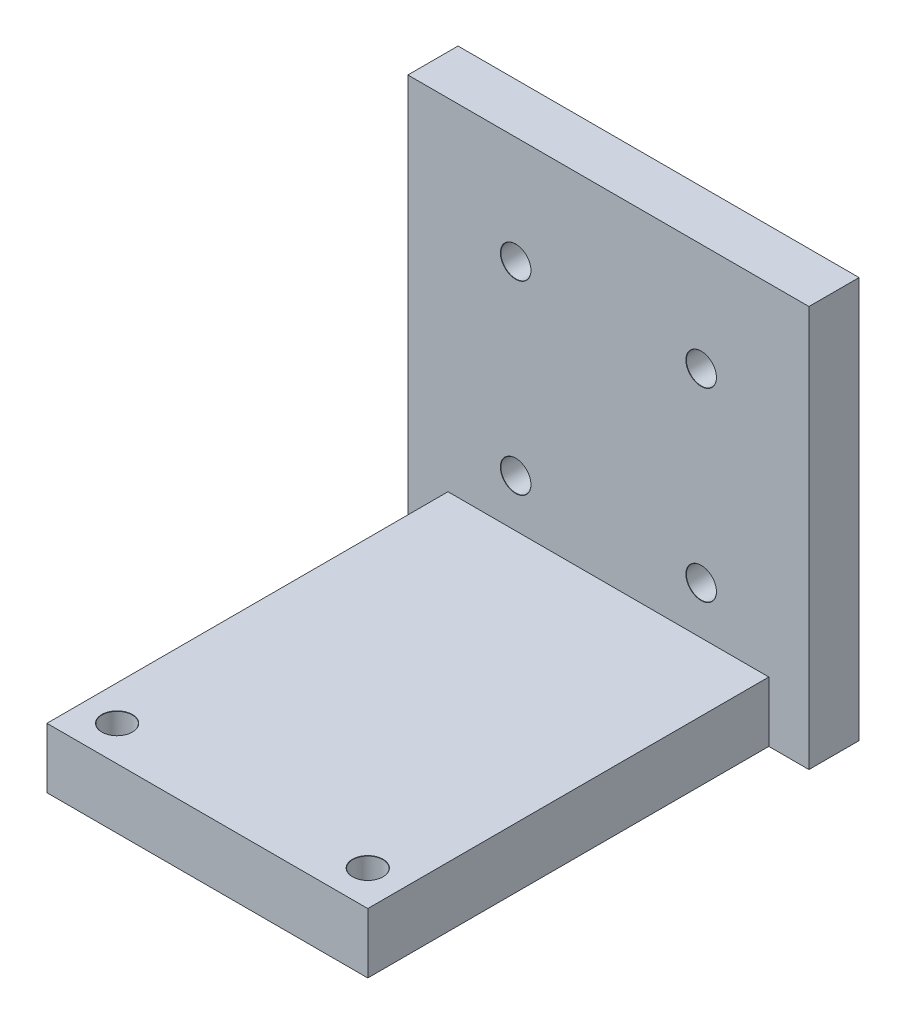
ISO-10303-21;
HEADER;
FILE_DESCRIPTION(('STEP AP214'),'2;1');
FILE_NAME('part.step','',(''),(''),'','','');
FILE_SCHEMA(('AUTOMOTIVE_DESIGN { 1 0 10303 214 1 1 1 1 }'));
ENDSEC;
DATA;
#1=APPLICATION_CONTEXT('core data for automotive mechanical design processes');
#2=APPLICATION_PROTOCOL_DEFINITION('international standard','automotive_design',2000,#1);
#3=PRODUCT_CONTEXT('',#1,'mechanical');
#4=PRODUCT('Part','Part','',(#3));
#5=PRODUCT_RELATED_PRODUCT_CATEGORY('part','',(#4));
#6=PRODUCT_DEFINITION_FORMATION('','',#4);
#7=PRODUCT_DEFINITION_CONTEXT('part definition',#1,'design');
#8=PRODUCT_DEFINITION('design','',#6,#7);
#9=PRODUCT_DEFINITION_SHAPE('','',#8);
#10=(LENGTH_UNIT() NAMED_UNIT(*) SI_UNIT(.MILLI.,.METRE.));
#11=(NAMED_UNIT(*) PLANE_ANGLE_UNIT() SI_UNIT($,.RADIAN.));
#12=(NAMED_UNIT(*) SI_UNIT($,.STERADIAN.) SOLID_ANGLE_UNIT());
#13=UNCERTAINTY_MEASURE_WITH_UNIT(LENGTH_MEASURE(1.E-05),#10,'distance_accuracy_value','');
#14=(GEOMETRIC_REPRESENTATION_CONTEXT(3) GLOBAL_UNCERTAINTY_ASSIGNED_CONTEXT((#13)) GLOBAL_UNIT_ASSIGNED_CONTEXT((#10,
#11,#12)) REPRESENTATION_CONTEXT('',''));
#15=CARTESIAN_POINT('',(0.,0.,0.));
#16=DIRECTION('',(0.,0.,1.));
#17=DIRECTION('',(1.,0.,0.));
#18=AXIS2_PLACEMENT_3D('',#15,#16,#17);
#19=CARTESIAN_POINT('',(0.,0.,5.));
#20=DIRECTION('',(0.,0.,-1.));
#21=DIRECTION('',(-1.,0.,0.));
#22=AXIS2_PLACEMENT_3D('',#19,#20,#21);
#23=PLANE('',#22);
#24=CARTESIAN_POINT('',(29.25,10.75,5.));
#25=DIRECTION('',(0.,0.,1.));
#26=DIRECTION('',(1.,0.,0.));
#27=AXIS2_PLACEMENT_3D('',#24,#25,#26);
#28=CIRCLE('',#27,1.525);
#29=CARTESIAN_POINT('',(30.775,10.75,5.));
#30=VERTEX_POINT('',#29);
#31=EDGE_CURVE('E171',#30,#30,#28,.T.);
#32=ORIENTED_EDGE('',*,*,#31,.F.);
#33=EDGE_LOOP('',(#32));
#34=FACE_BOUND('',#33,.T.);
#35=CARTESIAN_POINT('',(10.75,10.75,5.));
#36=DIRECTION('',(0.,0.,1.));
#37=DIRECTION('',(1.,0.,0.));
#38=AXIS2_PLACEMENT_3D('',#35,#36,#37);
#39=CIRCLE('',#38,1.525);
#40=CARTESIAN_POINT('',(12.275,10.75,5.));
#41=VERTEX_POINT('',#40);
#42=EDGE_CURVE('E159',#41,#41,#39,.T.);
#43=ORIENTED_EDGE('',*,*,#42,.F.);
#44=EDGE_LOOP('',(#43));
#45=FACE_BOUND('',#44,.T.);
#46=CARTESIAN_POINT('',(29.25,29.25,5.));
#47=DIRECTION('',(0.,0.,1.));
#48=DIRECTION('',(1.,0.,0.));
#49=AXIS2_PLACEMENT_3D('',#46,#47,#48);
#50=CIRCLE('',#49,1.525);
#51=CARTESIAN_POINT('',(30.775,29.25,5.));
#52=VERTEX_POINT('',#51);
#53=EDGE_CURVE('E147',#52,#52,#50,.T.);
#54=ORIENTED_EDGE('',*,*,#53,.F.);
#55=EDGE_LOOP('',(#54));
#56=FACE_BOUND('',#55,.T.);
#57=CARTESIAN_POINT('',(10.75,29.25,5.));
#58=DIRECTION('',(0.,0.,1.));
#59=DIRECTION('',(1.,0.,0.));
#60=AXIS2_PLACEMENT_3D('',#57,#58,#59);
#61=CIRCLE('',#60,1.525);
#62=CARTESIAN_POINT('',(12.275,29.25,5.));
#63=VERTEX_POINT('',#62);
#64=EDGE_CURVE('E129',#63,#63,#61,.T.);
#65=ORIENTED_EDGE('',*,*,#64,.F.);
#66=EDGE_LOOP('',(#65));
#67=FACE_BOUND('',#66,.T.);
#68=DIRECTION('',(0.,-1.,0.));
#69=VECTOR('',#68,1.);
#70=CARTESIAN_POINT('',(4.,0.,5.));
#71=LINE('',#70,#69);
#72=CARTESIAN_POINT('',(4.,6.,5.));
#73=VERTEX_POINT('',#72);
#74=CARTESIAN_POINT('',(4.,0.,5.));
#75=VERTEX_POINT('',#74);
#76=EDGE_CURVE('E55',#73,#75,#71,.T.);
#77=ORIENTED_EDGE('',*,*,#76,.F.);
#78=DIRECTION('',(-1.,0.,0.));
#79=VECTOR('',#78,1.);
#80=CARTESIAN_POINT('',(4.,6.,5.));
#81=LINE('',#80,#79);
#82=CARTESIAN_POINT('',(36.,6.,5.));
#83=VERTEX_POINT('',#82);
#84=EDGE_CURVE('E125',#83,#73,#81,.T.);
#85=ORIENTED_EDGE('',*,*,#84,.F.);
#86=DIRECTION('',(0.,1.,0.));
#87=VECTOR('',#86,1.);
#88=CARTESIAN_POINT('',(36.,0.,5.));
#89=LINE('',#88,#87);
#90=CARTESIAN_POINT('',(36.,0.,5.));
#91=VERTEX_POINT('',#90);
#92=EDGE_CURVE('E61',#91,#83,#89,.T.);
#93=ORIENTED_EDGE('',*,*,#92,.F.);
#94=DIRECTION('',(1.,0.,0.));
#95=VECTOR('',#94,1.);
#96=CARTESIAN_POINT('',(0.,0.,5.));
#97=LINE('',#96,#95);
#98=CARTESIAN_POINT('',(40.,0.,5.));
#99=VERTEX_POINT('',#98);
#100=EDGE_CURVE('E188',#91,#99,#97,.T.);
#101=ORIENTED_EDGE('',*,*,#100,.T.);
#102=DIRECTION('',(0.,1.,0.));
#103=VECTOR('',#102,1.);
#104=CARTESIAN_POINT('',(40.,0.,5.));
#105=LINE('',#104,#103);
#106=CARTESIAN_POINT('',(40.,40.,5.));
#107=VERTEX_POINT('',#106);
#108=EDGE_CURVE('E193',#99,#107,#105,.T.);
#109=ORIENTED_EDGE('',*,*,#108,.T.);
#110=DIRECTION('',(-1.,0.,0.));
#111=VECTOR('',#110,1.);
#112=CARTESIAN_POINT('',(0.,40.,5.));
#113=LINE('',#112,#111);
#114=CARTESIAN_POINT('',(0.,40.,5.));
#115=VERTEX_POINT('',#114);
#116=EDGE_CURVE('E196',#107,#115,#113,.T.);
#117=ORIENTED_EDGE('',*,*,#116,.T.);
#118=DIRECTION('',(0.,-1.,0.));
#119=VECTOR('',#118,1.);
#120=CARTESIAN_POINT('',(0.,0.,5.));
#121=LINE('',#120,#119);
#122=CARTESIAN_POINT('',(0.,0.,5.));
#123=VERTEX_POINT('',#122);
#124=EDGE_CURVE('E184',#115,#123,#121,.T.);
#125=ORIENTED_EDGE('',*,*,#124,.T.);
#126=EDGE_CURVE('E190',#123,#75,#97,.T.);
#127=ORIENTED_EDGE('',*,*,#126,.T.);
#128=EDGE_LOOP('',(#77,#85,#93,#101,#109,#117,#125,#127));
#129=FACE_BOUND('',#128,.T.);
#130=ADVANCED_FACE('F39',(#34,#45,#56,#67,#129),#23,.F.);
#131=CARTESIAN_POINT('',(0.,0.,5.));
#132=DIRECTION('',(1.,0.,0.));
#133=DIRECTION('',(0.,0.,-1.));
#134=AXIS2_PLACEMENT_3D('',#131,#132,#133);
#135=PLANE('',#134);
#136=DIRECTION('',(0.,-1.,0.));
#137=VECTOR('',#136,1.);
#138=CARTESIAN_POINT('',(0.,0.,0.));
#139=LINE('',#138,#137);
#140=CARTESIAN_POINT('',(0.,40.,0.));
#141=VERTEX_POINT('',#140);
#142=CARTESIAN_POINT('',(0.,0.,0.));
#143=VERTEX_POINT('',#142);
#144=EDGE_CURVE('E183',#141,#143,#139,.T.);
#145=ORIENTED_EDGE('',*,*,#144,.T.);
#146=DIRECTION('',(0.,0.,-1.));
#147=VECTOR('',#146,1.);
#148=CARTESIAN_POINT('',(0.,0.,5.));
#149=LINE('',#148,#147);
#150=EDGE_CURVE('E11',#123,#143,#149,.T.);
#151=ORIENTED_EDGE('',*,*,#150,.F.);
#152=ORIENTED_EDGE('',*,*,#124,.F.);
#153=DIRECTION('',(0.,0.,-1.));
#154=VECTOR('',#153,1.);
#155=CARTESIAN_POINT('',(0.,40.,5.));
#156=LINE('',#155,#154);
#157=EDGE_CURVE('E199',#115,#141,#156,.T.);
#158=ORIENTED_EDGE('',*,*,#157,.T.);
#159=EDGE_LOOP('',(#145,#151,#152,#158));
#160=FACE_BOUND('',#159,.T.);
#161=ADVANCED_FACE('F41',(#160),#135,.F.);
#162=CARTESIAN_POINT('',(0.,0.,5.));
#163=DIRECTION('',(0.,1.,0.));
#164=DIRECTION('',(0.,0.,1.));
#165=AXIS2_PLACEMENT_3D('',#162,#163,#164);
#166=PLANE('',#165);
#167=CARTESIAN_POINT('',(7.5,0.,41.5));
#168=DIRECTION('',(0.,1.,0.));
#169=DIRECTION('',(0.,0.,1.));
#170=AXIS2_PLACEMENT_3D('',#167,#168,#169);
#171=CIRCLE('',#170,1.5);
#172=CARTESIAN_POINT('',(7.5,0.,43.));
#173=VERTEX_POINT('',#172);
#174=EDGE_CURVE('E295',#173,#173,#171,.T.);
#175=ORIENTED_EDGE('',*,*,#174,.T.);
#176=EDGE_LOOP('',(#175));
#177=FACE_BOUND('',#176,.T.);
#178=CARTESIAN_POINT('',(32.5,0.,41.5));
#179=DIRECTION('',(0.,1.,0.));
#180=DIRECTION('',(0.,0.,1.));
#181=AXIS2_PLACEMENT_3D('',#178,#179,#180);
#182=CIRCLE('',#181,1.5);
#183=CARTESIAN_POINT('',(32.5,0.,43.));
#184=VERTEX_POINT('',#183);
#185=EDGE_CURVE('E249',#184,#184,#182,.T.);
#186=ORIENTED_EDGE('',*,*,#185,.T.);
#187=EDGE_LOOP('',(#186));
#188=FACE_BOUND('',#187,.T.);
#189=DIRECTION('',(1.,0.,0.));
#190=VECTOR('',#189,1.);
#191=CARTESIAN_POINT('',(0.,0.,0.));
#192=LINE('',#191,#190);
#193=CARTESIAN_POINT('',(40.,0.,0.));
#194=VERTEX_POINT('',#193);
#195=EDGE_CURVE('E203',#143,#194,#192,.T.);
#196=ORIENTED_EDGE('',*,*,#195,.T.);
#197=DIRECTION('',(0.,0.,-1.));
#198=VECTOR('',#197,1.);
#199=CARTESIAN_POINT('',(40.,0.,5.));
#200=LINE('',#199,#198);
#201=EDGE_CURVE('E48',#99,#194,#200,.T.);
#202=ORIENTED_EDGE('',*,*,#201,.F.);
#203=ORIENTED_EDGE('',*,*,#100,.F.);
#204=DIRECTION('',(0.,0.,-1.));
#205=VECTOR('',#204,1.);
#206=CARTESIAN_POINT('',(36.,0.,45.));
#207=LINE('',#206,#205);
#208=CARTESIAN_POINT('',(36.,0.,45.));
#209=VERTEX_POINT('',#208);
#210=EDGE_CURVE('E110',#209,#91,#207,.T.);
#211=ORIENTED_EDGE('',*,*,#210,.F.);
#212=DIRECTION('',(1.,0.,0.));
#213=VECTOR('',#212,1.);
#214=CARTESIAN_POINT('',(4.,0.,45.));
#215=LINE('',#214,#213);
#216=CARTESIAN_POINT('',(4.,0.,45.));
#217=VERTEX_POINT('',#216);
#218=EDGE_CURVE('E104',#217,#209,#215,.T.);
#219=ORIENTED_EDGE('',*,*,#218,.F.);
#220=DIRECTION('',(0.,0.,-1.));
#221=VECTOR('',#220,1.);
#222=CARTESIAN_POINT('',(4.,0.,45.));
#223=LINE('',#222,#221);
#224=EDGE_CURVE('E108',#217,#75,#223,.T.);
#225=ORIENTED_EDGE('',*,*,#224,.T.);
#226=ORIENTED_EDGE('',*,*,#126,.F.);
#227=ORIENTED_EDGE('',*,*,#150,.T.);
#228=EDGE_LOOP('',(#196,#202,#203,#211,#219,#225,#226,#227));
#229=FACE_BOUND('',#228,.T.);
#230=ADVANCED_FACE('F106',(#177,#188,#229),#166,.F.);
#231=CARTESIAN_POINT('',(40.,0.,5.));
#232=DIRECTION('',(-1.,0.,0.));
#233=DIRECTION('',(0.,0.,1.));
#234=AXIS2_PLACEMENT_3D('',#231,#232,#233);
#235=PLANE('',#234);
#236=DIRECTION('',(0.,1.,0.));
#237=VECTOR('',#236,1.);
#238=CARTESIAN_POINT('',(40.,0.,0.));
#239=LINE('',#238,#237);
#240=CARTESIAN_POINT('',(40.,40.,0.));
#241=VERTEX_POINT('',#240);
#242=EDGE_CURVE('E206',#194,#241,#239,.T.);
#243=ORIENTED_EDGE('',*,*,#242,.T.);
#244=DIRECTION('',(0.,0.,-1.));
#245=VECTOR('',#244,1.);
#246=CARTESIAN_POINT('',(40.,40.,5.));
#247=LINE('',#246,#245);
#248=EDGE_CURVE('E214',#107,#241,#247,.T.);
#249=ORIENTED_EDGE('',*,*,#248,.F.);
#250=ORIENTED_EDGE('',*,*,#108,.F.);
#251=ORIENTED_EDGE('',*,*,#201,.T.);
#252=EDGE_LOOP('',(#243,#249,#250,#251));
#253=FACE_BOUND('',#252,.T.);
#254=ADVANCED_FACE('F223',(#253),#235,.F.);
#255=CARTESIAN_POINT('',(0.,40.,5.));
#256=DIRECTION('',(0.,-1.,0.));
#257=DIRECTION('',(0.,0.,-1.));
#258=AXIS2_PLACEMENT_3D('',#255,#256,#257);
#259=PLANE('',#258);
#260=DIRECTION('',(-1.,0.,0.));
#261=VECTOR('',#260,1.);
#262=CARTESIAN_POINT('',(0.,40.,0.));
#263=LINE('',#262,#261);
#264=EDGE_CURVE('E189',#241,#141,#263,.T.);
#265=ORIENTED_EDGE('',*,*,#264,.T.);
#266=ORIENTED_EDGE('',*,*,#157,.F.);
#267=ORIENTED_EDGE('',*,*,#116,.F.);
#268=ORIENTED_EDGE('',*,*,#248,.T.);
#269=EDGE_LOOP('',(#265,#266,#267,#268));
#270=FACE_BOUND('',#269,.T.);
#271=ADVANCED_FACE('F231',(#270),#259,.F.);
#272=CARTESIAN_POINT('',(0.,0.,0.));
#273=DIRECTION('',(0.,0.,-1.));
#274=DIRECTION('',(-1.,0.,0.));
#275=AXIS2_PLACEMENT_3D('',#272,#273,#274);
#276=PLANE('',#275);
#277=CARTESIAN_POINT('',(10.75,29.25,0.));
#278=DIRECTION('',(0.,0.,1.));
#279=DIRECTION('',(1.,0.,0.));
#280=AXIS2_PLACEMENT_3D('',#277,#278,#279);
#281=CIRCLE('',#280,1.5);
#282=CARTESIAN_POINT('',(12.25,29.25,0.));
#283=VERTEX_POINT('',#282);
#284=EDGE_CURVE('E143',#283,#283,#281,.T.);
#285=ORIENTED_EDGE('',*,*,#284,.T.);
#286=EDGE_LOOP('',(#285));
#287=FACE_BOUND('',#286,.T.);
#288=CARTESIAN_POINT('',(29.25,29.25,0.));
#289=DIRECTION('',(0.,0.,1.));
#290=DIRECTION('',(1.,0.,0.));
#291=AXIS2_PLACEMENT_3D('',#288,#289,#290);
#292=CIRCLE('',#291,1.5);
#293=CARTESIAN_POINT('',(30.75,29.25,0.));
#294=VERTEX_POINT('',#293);
#295=EDGE_CURVE('E155',#294,#294,#292,.T.);
#296=ORIENTED_EDGE('',*,*,#295,.T.);
#297=EDGE_LOOP('',(#296));
#298=FACE_BOUND('',#297,.T.);
#299=CARTESIAN_POINT('',(10.75,10.75,0.));
#300=DIRECTION('',(0.,0.,1.));
#301=DIRECTION('',(1.,0.,0.));
#302=AXIS2_PLACEMENT_3D('',#299,#300,#301);
#303=CIRCLE('',#302,1.5);
#304=CARTESIAN_POINT('',(12.25,10.75,0.));
#305=VERTEX_POINT('',#304);
#306=EDGE_CURVE('E167',#305,#305,#303,.T.);
#307=ORIENTED_EDGE('',*,*,#306,.T.);
#308=EDGE_LOOP('',(#307));
#309=FACE_BOUND('',#308,.T.);
#310=CARTESIAN_POINT('',(29.25,10.75,0.));
#311=DIRECTION('',(0.,0.,1.));
#312=DIRECTION('',(1.,0.,0.));
#313=AXIS2_PLACEMENT_3D('',#310,#311,#312);
#314=CIRCLE('',#313,1.5);
#315=CARTESIAN_POINT('',(30.75,10.75,0.));
#316=VERTEX_POINT('',#315);
#317=EDGE_CURVE('E179',#316,#316,#314,.T.);
#318=ORIENTED_EDGE('',*,*,#317,.T.);
#319=EDGE_LOOP('',(#318));
#320=FACE_BOUND('',#319,.T.);
#321=ORIENTED_EDGE('',*,*,#144,.F.);
#322=ORIENTED_EDGE('',*,*,#264,.F.);
#323=ORIENTED_EDGE('',*,*,#242,.F.);
#324=ORIENTED_EDGE('',*,*,#195,.F.);
#325=EDGE_LOOP('',(#321,#322,#323,#324));
#326=FACE_BOUND('',#325,.T.);
#327=ADVANCED_FACE('F228',(#287,#298,#309,#320,#326),#276,.T.);
#328=CARTESIAN_POINT('',(29.25,10.75,5.));
#329=DIRECTION('',(0.,0.,1.));
#330=DIRECTION('',(1.,0.,0.));
#331=AXIS2_PLACEMENT_3D('',#328,#329,#330);
#332=CYLINDRICAL_SURFACE('',#331,1.5);
#333=ORIENTED_EDGE('',*,*,#317,.F.);
#334=EDGE_LOOP('',(#333));
#335=FACE_BOUND('',#334,.T.);
#336=CARTESIAN_POINT('',(29.25,10.75,4.975));
#337=DIRECTION('',(0.,0.,1.));
#338=DIRECTION('',(1.,0.,0.));
#339=AXIS2_PLACEMENT_3D('',#336,#337,#338);
#340=CIRCLE('',#339,1.5);
#341=CARTESIAN_POINT('',(30.75,10.75,4.975));
#342=VERTEX_POINT('',#341);
#343=EDGE_CURVE('E175',#342,#342,#340,.T.);
#344=ORIENTED_EDGE('',*,*,#343,.T.);
#345=EDGE_LOOP('',(#344));
#346=FACE_BOUND('',#345,.T.);
#347=ADVANCED_FACE('F280',(#335,#346),#332,.F.);
#348=CARTESIAN_POINT('',(29.25,10.75,5.));
#349=DIRECTION('',(0.,0.,1.));
#350=DIRECTION('',(1.,0.,0.));
#351=AXIS2_PLACEMENT_3D('',#348,#349,#350);
#352=CONICAL_SURFACE('',#351,1.525,0.785398163397466);
#353=ORIENTED_EDGE('',*,*,#343,.F.);
#354=EDGE_LOOP('',(#353));
#355=FACE_BOUND('',#354,.T.);
#356=ORIENTED_EDGE('',*,*,#31,.T.);
#357=EDGE_LOOP('',(#356));
#358=FACE_BOUND('',#357,.T.);
#359=ADVANCED_FACE('F450',(#355,#358),#352,.F.);
#360=CARTESIAN_POINT('',(10.75,10.75,5.));
#361=DIRECTION('',(0.,0.,1.));
#362=DIRECTION('',(1.,0.,0.));
#363=AXIS2_PLACEMENT_3D('',#360,#361,#362);
#364=CYLINDRICAL_SURFACE('',#363,1.5);
#365=ORIENTED_EDGE('',*,*,#306,.F.);
#366=EDGE_LOOP('',(#365));
#367=FACE_BOUND('',#366,.T.);
#368=CARTESIAN_POINT('',(10.75,10.75,4.975));
#369=DIRECTION('',(0.,0.,1.));
#370=DIRECTION('',(1.,0.,0.));
#371=AXIS2_PLACEMENT_3D('',#368,#369,#370);
#372=CIRCLE('',#371,1.5);
#373=CARTESIAN_POINT('',(12.25,10.75,4.975));
#374=VERTEX_POINT('',#373);
#375=EDGE_CURVE('E163',#374,#374,#372,.T.);
#376=ORIENTED_EDGE('',*,*,#375,.T.);
#377=EDGE_LOOP('',(#376));
#378=FACE_BOUND('',#377,.T.);
#379=ADVANCED_FACE('F441',(#367,#378),#364,.F.);
#380=CARTESIAN_POINT('',(10.75,10.75,5.));
#381=DIRECTION('',(0.,0.,1.));
#382=DIRECTION('',(1.,0.,0.));
#383=AXIS2_PLACEMENT_3D('',#380,#381,#382);
#384=CONICAL_SURFACE('',#383,1.525,0.785398163397466);
#385=ORIENTED_EDGE('',*,*,#375,.F.);
#386=EDGE_LOOP('',(#385));
#387=FACE_BOUND('',#386,.T.);
#388=ORIENTED_EDGE('',*,*,#42,.T.);
#389=EDGE_LOOP('',(#388));
#390=FACE_BOUND('',#389,.T.);
#391=ADVANCED_FACE('F432',(#387,#390),#384,.F.);
#392=CARTESIAN_POINT('',(29.25,29.25,5.));
#393=DIRECTION('',(0.,0.,1.));
#394=DIRECTION('',(1.,0.,0.));
#395=AXIS2_PLACEMENT_3D('',#392,#393,#394);
#396=CYLINDRICAL_SURFACE('',#395,1.5);
#397=ORIENTED_EDGE('',*,*,#295,.F.);
#398=EDGE_LOOP('',(#397));
#399=FACE_BOUND('',#398,.T.);
#400=CARTESIAN_POINT('',(29.25,29.25,4.975));
#401=DIRECTION('',(0.,0.,1.));
#402=DIRECTION('',(1.,0.,0.));
#403=AXIS2_PLACEMENT_3D('',#400,#401,#402);
#404=CIRCLE('',#403,1.5);
#405=CARTESIAN_POINT('',(30.75,29.25,4.975));
#406=VERTEX_POINT('',#405);
#407=EDGE_CURVE('E151',#406,#406,#404,.T.);
#408=ORIENTED_EDGE('',*,*,#407,.T.);
#409=EDGE_LOOP('',(#408));
#410=FACE_BOUND('',#409,.T.);
#411=ADVANCED_FACE('F423',(#399,#410),#396,.F.);
#412=CARTESIAN_POINT('',(29.25,29.25,5.));
#413=DIRECTION('',(0.,0.,1.));
#414=DIRECTION('',(1.,0.,0.));
#415=AXIS2_PLACEMENT_3D('',#412,#413,#414);
#416=CONICAL_SURFACE('',#415,1.525,0.785398163397466);
#417=ORIENTED_EDGE('',*,*,#407,.F.);
#418=EDGE_LOOP('',(#417));
#419=FACE_BOUND('',#418,.T.);
#420=ORIENTED_EDGE('',*,*,#53,.T.);
#421=EDGE_LOOP('',(#420));
#422=FACE_BOUND('',#421,.T.);
#423=ADVANCED_FACE('F414',(#419,#422),#416,.F.);
#424=CARTESIAN_POINT('',(10.75,29.25,5.));
#425=DIRECTION('',(0.,0.,1.));
#426=DIRECTION('',(1.,0.,0.));
#427=AXIS2_PLACEMENT_3D('',#424,#425,#426);
#428=CYLINDRICAL_SURFACE('',#427,1.5);
#429=ORIENTED_EDGE('',*,*,#284,.F.);
#430=EDGE_LOOP('',(#429));
#431=FACE_BOUND('',#430,.T.);
#432=CARTESIAN_POINT('',(10.75,29.25,4.975));
#433=DIRECTION('',(0.,0.,1.));
#434=DIRECTION('',(1.,0.,0.));
#435=AXIS2_PLACEMENT_3D('',#432,#433,#434);
#436=CIRCLE('',#435,1.5);
#437=CARTESIAN_POINT('',(12.25,29.25,4.975));
#438=VERTEX_POINT('',#437);
#439=EDGE_CURVE('E134',#438,#438,#436,.T.);
#440=ORIENTED_EDGE('',*,*,#439,.T.);
#441=EDGE_LOOP('',(#440));
#442=FACE_BOUND('',#441,.T.);
#443=ADVANCED_FACE('F405',(#431,#442),#428,.F.);
#444=CARTESIAN_POINT('',(10.75,29.25,5.));
#445=DIRECTION('',(0.,0.,1.));
#446=DIRECTION('',(1.,0.,0.));
#447=AXIS2_PLACEMENT_3D('',#444,#445,#446);
#448=CONICAL_SURFACE('',#447,1.525,0.785398163397466);
#449=ORIENTED_EDGE('',*,*,#439,.F.);
#450=EDGE_LOOP('',(#449));
#451=FACE_BOUND('',#450,.T.);
#452=ORIENTED_EDGE('',*,*,#64,.T.);
#453=EDGE_LOOP('',(#452));
#454=FACE_BOUND('',#453,.T.);
#455=ADVANCED_FACE('F384',(#451,#454),#448,.F.);
#456=CARTESIAN_POINT('',(4.,0.,45.));
#457=DIRECTION('',(1.,0.,0.));
#458=DIRECTION('',(0.,0.,-1.));
#459=AXIS2_PLACEMENT_3D('',#456,#457,#458);
#460=PLANE('',#459);
#461=ORIENTED_EDGE('',*,*,#76,.T.);
#462=ORIENTED_EDGE('',*,*,#224,.F.);
#463=DIRECTION('',(0.,-1.,0.));
#464=VECTOR('',#463,1.);
#465=CARTESIAN_POINT('',(4.,0.,45.));
#466=LINE('',#465,#464);
#467=CARTESIAN_POINT('',(4.,6.,45.));
#468=VERTEX_POINT('',#467);
#469=EDGE_CURVE('E115',#468,#217,#466,.T.);
#470=ORIENTED_EDGE('',*,*,#469,.F.);
#471=DIRECTION('',(0.,0.,-1.));
#472=VECTOR('',#471,1.);
#473=CARTESIAN_POINT('',(4.,6.,45.));
#474=LINE('',#473,#472);
#475=EDGE_CURVE('E244',#468,#73,#474,.T.);
#476=ORIENTED_EDGE('',*,*,#475,.T.);
#477=EDGE_LOOP('',(#461,#462,#470,#476));
#478=FACE_BOUND('',#477,.T.);
#479=ADVANCED_FACE('F127',(#478),#460,.F.);
#480=CARTESIAN_POINT('',(36.,0.,45.));
#481=DIRECTION('',(-1.,0.,0.));
#482=DIRECTION('',(0.,0.,1.));
#483=AXIS2_PLACEMENT_3D('',#480,#481,#482);
#484=PLANE('',#483);
#485=ORIENTED_EDGE('',*,*,#92,.T.);
#486=DIRECTION('',(0.,0.,-1.));
#487=VECTOR('',#486,1.);
#488=CARTESIAN_POINT('',(36.,6.,45.));
#489=LINE('',#488,#487);
#490=CARTESIAN_POINT('',(36.,6.,45.));
#491=VERTEX_POINT('',#490);
#492=EDGE_CURVE('E136',#491,#83,#489,.T.);
#493=ORIENTED_EDGE('',*,*,#492,.F.);
#494=DIRECTION('',(0.,1.,0.));
#495=VECTOR('',#494,1.);
#496=CARTESIAN_POINT('',(36.,0.,45.));
#497=LINE('',#496,#495);
#498=EDGE_CURVE('E114',#209,#491,#497,.T.);
#499=ORIENTED_EDGE('',*,*,#498,.F.);
#500=ORIENTED_EDGE('',*,*,#210,.T.);
#501=EDGE_LOOP('',(#485,#493,#499,#500));
#502=FACE_BOUND('',#501,.T.);
#503=ADVANCED_FACE('F238',(#502),#484,.F.);
#504=CARTESIAN_POINT('',(4.,6.,45.));
#505=DIRECTION('',(0.,-1.,0.));
#506=DIRECTION('',(0.,0.,-1.));
#507=AXIS2_PLACEMENT_3D('',#504,#505,#506);
#508=PLANE('',#507);
#509=CARTESIAN_POINT('',(7.5,6.,41.5));
#510=DIRECTION('',(0.,1.,0.));
#511=DIRECTION('',(0.,0.,1.));
#512=AXIS2_PLACEMENT_3D('',#509,#510,#511);
#513=CIRCLE('',#512,1.525);
#514=CARTESIAN_POINT('',(7.5,6.,43.025));
#515=VERTEX_POINT('',#514);
#516=EDGE_CURVE('E316',#515,#515,#513,.T.);
#517=ORIENTED_EDGE('',*,*,#516,.F.);
#518=EDGE_LOOP('',(#517));
#519=FACE_BOUND('',#518,.T.);
#520=CARTESIAN_POINT('',(32.5,6.,41.5));
#521=DIRECTION('',(0.,1.,0.));
#522=DIRECTION('',(0.,0.,1.));
#523=AXIS2_PLACEMENT_3D('',#520,#521,#522);
#524=CIRCLE('',#523,1.525);
#525=CARTESIAN_POINT('',(32.5,6.,43.025));
#526=VERTEX_POINT('',#525);
#527=EDGE_CURVE('E304',#526,#526,#524,.T.);
#528=ORIENTED_EDGE('',*,*,#527,.F.);
#529=EDGE_LOOP('',(#528));
#530=FACE_BOUND('',#529,.T.);
#531=ORIENTED_EDGE('',*,*,#84,.T.);
#532=ORIENTED_EDGE('',*,*,#475,.F.);
#533=DIRECTION('',(-1.,0.,0.));
#534=VECTOR('',#533,1.);
#535=CARTESIAN_POINT('',(4.,6.,45.));
#536=LINE('',#535,#534);
#537=EDGE_CURVE('E120',#491,#468,#536,.T.);
#538=ORIENTED_EDGE('',*,*,#537,.F.);
#539=ORIENTED_EDGE('',*,*,#492,.T.);
#540=EDGE_LOOP('',(#531,#532,#538,#539));
#541=FACE_BOUND('',#540,.T.);
#542=ADVANCED_FACE('F257',(#519,#530,#541),#508,.F.);
#543=CARTESIAN_POINT('',(0.,0.,45.));
#544=DIRECTION('',(0.,0.,-1.));
#545=DIRECTION('',(-1.,0.,0.));
#546=AXIS2_PLACEMENT_3D('',#543,#544,#545);
#547=PLANE('',#546);
#548=ORIENTED_EDGE('',*,*,#469,.T.);
#549=ORIENTED_EDGE('',*,*,#218,.T.);
#550=ORIENTED_EDGE('',*,*,#498,.T.);
#551=ORIENTED_EDGE('',*,*,#537,.T.);
#552=EDGE_LOOP('',(#548,#549,#550,#551));
#553=FACE_BOUND('',#552,.T.);
#554=ADVANCED_FACE('F118',(#553),#547,.F.);
#555=CARTESIAN_POINT('',(32.5,6.,41.5));
#556=DIRECTION('',(0.,1.,0.));
#557=DIRECTION('',(0.,0.,1.));
#558=AXIS2_PLACEMENT_3D('',#555,#556,#557);
#559=CYLINDRICAL_SURFACE('',#558,1.49999999999999);
#560=ORIENTED_EDGE('',*,*,#185,.F.);
#561=EDGE_LOOP('',(#560));
#562=FACE_BOUND('',#561,.T.);
#563=CARTESIAN_POINT('',(32.5,5.975,41.5));
#564=DIRECTION('',(0.,1.,0.));
#565=DIRECTION('',(0.,0.,1.));
#566=AXIS2_PLACEMENT_3D('',#563,#564,#565);
#567=CIRCLE('',#566,1.49999999999999);
#568=CARTESIAN_POINT('',(32.5,5.975,43.));
#569=VERTEX_POINT('',#568);
#570=EDGE_CURVE('E300',#569,#569,#567,.T.);
#571=ORIENTED_EDGE('',*,*,#570,.T.);
#572=EDGE_LOOP('',(#571));
#573=FACE_BOUND('',#572,.T.);
#574=ADVANCED_FACE('F265',(#562,#573),#559,.F.);
#575=CARTESIAN_POINT('',(32.5,6.,41.5));
#576=DIRECTION('',(0.,1.,0.));
#577=DIRECTION('',(0.,0.,1.));
#578=AXIS2_PLACEMENT_3D('',#575,#576,#577);
#579=CONICAL_SURFACE('',#578,1.525,0.785398163397691);
#580=ORIENTED_EDGE('',*,*,#570,.F.);
#581=EDGE_LOOP('',(#580));
#582=FACE_BOUND('',#581,.T.);
#583=ORIENTED_EDGE('',*,*,#527,.T.);
#584=EDGE_LOOP('',(#583));
#585=FACE_BOUND('',#584,.T.);
#586=ADVANCED_FACE('F328',(#582,#585),#579,.F.);
#587=CARTESIAN_POINT('',(7.5,6.,41.5));
#588=DIRECTION('',(0.,1.,0.));
#589=DIRECTION('',(0.,0.,1.));
#590=AXIS2_PLACEMENT_3D('',#587,#588,#589);
#591=CYLINDRICAL_SURFACE('',#590,1.49999999999999);
#592=ORIENTED_EDGE('',*,*,#174,.F.);
#593=EDGE_LOOP('',(#592));
#594=FACE_BOUND('',#593,.T.);
#595=CARTESIAN_POINT('',(7.5,5.975,41.5));
#596=DIRECTION('',(0.,1.,0.));
#597=DIRECTION('',(0.,0.,1.));
#598=AXIS2_PLACEMENT_3D('',#595,#596,#597);
#599=CIRCLE('',#598,1.49999999999999);
#600=CARTESIAN_POINT('',(7.5,5.975,43.));
#601=VERTEX_POINT('',#600);
#602=EDGE_CURVE('E312',#601,#601,#599,.T.);
#603=ORIENTED_EDGE('',*,*,#602,.T.);
#604=EDGE_LOOP('',(#603));
#605=FACE_BOUND('',#604,.T.);
#606=ADVANCED_FACE('F322',(#594,#605),#591,.F.);
#607=CARTESIAN_POINT('',(7.5,6.,41.5));
#608=DIRECTION('',(0.,1.,0.));
#609=DIRECTION('',(0.,0.,1.));
#610=AXIS2_PLACEMENT_3D('',#607,#608,#609);
#611=CONICAL_SURFACE('',#610,1.525,0.785398163397726);
#612=ORIENTED_EDGE('',*,*,#602,.F.);
#613=EDGE_LOOP('',(#612));
#614=FACE_BOUND('',#613,.T.);
#615=ORIENTED_EDGE('',*,*,#516,.T.);
#616=EDGE_LOOP('',(#615));
#617=FACE_BOUND('',#616,.T.);
#618=ADVANCED_FACE('F320',(#614,#617),#611,.F.);
#619=CLOSED_SHELL('',(#130,#161,#230,#254,#271,#327,#347,#359,#379,#391,#411,#423,#443,#455,
#479,#503,#542,#554,#574,#586,#606,#618));
#620=MANIFOLD_SOLID_BREP('B2',#619);
#621=ADVANCED_BREP_SHAPE_REPRESENTATION('',(#18,#620),#14);
#622=SHAPE_DEFINITION_REPRESENTATION(#9,#621);
ENDSEC;
END-ISO-10303-21;
